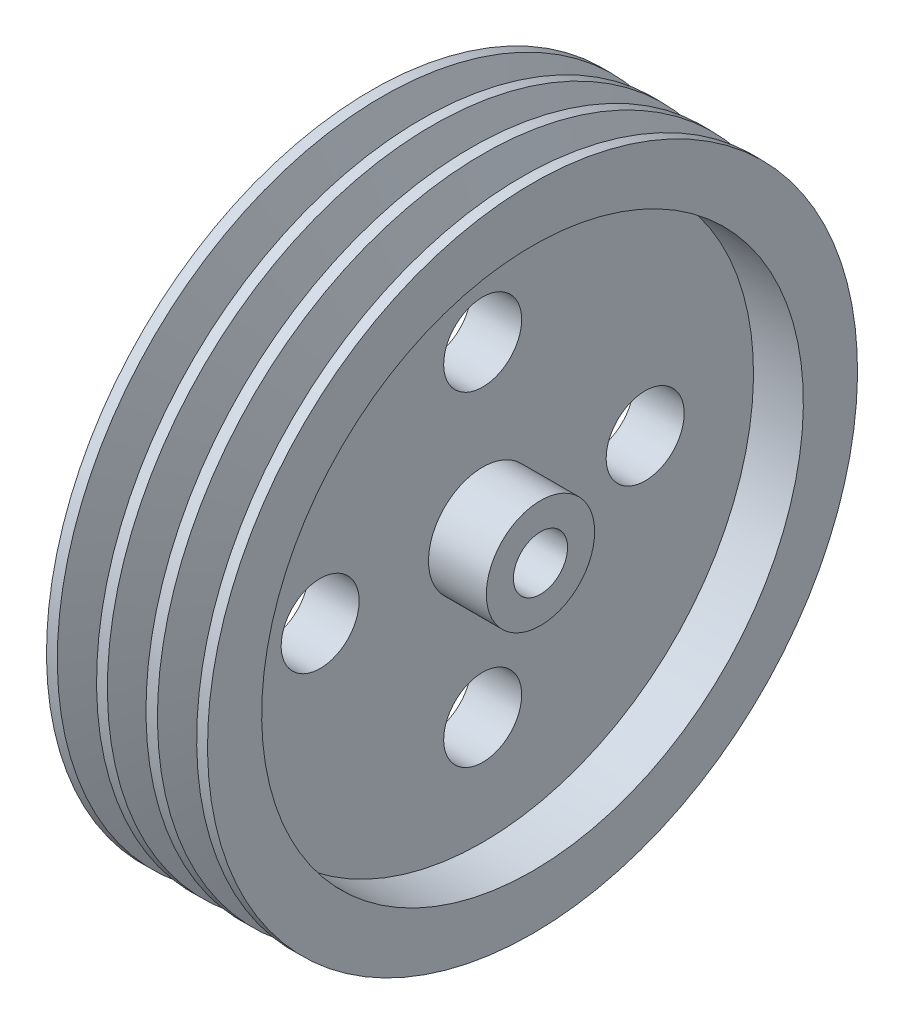
ISO-10303-21;
HEADER;
FILE_DESCRIPTION(('STEP AP214'),'2;1');
FILE_NAME('part.step','',(''),(''),'','','');
FILE_SCHEMA(('AUTOMOTIVE_DESIGN { 1 0 10303 214 1 1 1 1 }'));
ENDSEC;
DATA;
#1=APPLICATION_CONTEXT('core data for automotive mechanical design processes');
#2=APPLICATION_PROTOCOL_DEFINITION('international standard','automotive_design',2000,#1);
#3=PRODUCT_CONTEXT('',#1,'mechanical');
#4=PRODUCT('Part','Part','',(#3));
#5=PRODUCT_RELATED_PRODUCT_CATEGORY('part','',(#4));
#6=PRODUCT_DEFINITION_FORMATION('','',#4);
#7=PRODUCT_DEFINITION_CONTEXT('part definition',#1,'design');
#8=PRODUCT_DEFINITION('design','',#6,#7);
#9=PRODUCT_DEFINITION_SHAPE('','',#8);
#10=(LENGTH_UNIT() NAMED_UNIT(*) SI_UNIT(.MILLI.,.METRE.));
#11=(NAMED_UNIT(*) PLANE_ANGLE_UNIT() SI_UNIT($,.RADIAN.));
#12=(NAMED_UNIT(*) SI_UNIT($,.STERADIAN.) SOLID_ANGLE_UNIT());
#13=UNCERTAINTY_MEASURE_WITH_UNIT(LENGTH_MEASURE(1.E-05),#10,'distance_accuracy_value','');
#14=(GEOMETRIC_REPRESENTATION_CONTEXT(3) GLOBAL_UNCERTAINTY_ASSIGNED_CONTEXT((#13)) GLOBAL_UNIT_ASSIGNED_CONTEXT((#10,
#11,#12)) REPRESENTATION_CONTEXT('',''));
#15=CARTESIAN_POINT('',(0.,0.,0.));
#16=DIRECTION('',(0.,0.,1.));
#17=DIRECTION('',(1.,0.,0.));
#18=AXIS2_PLACEMENT_3D('',#15,#16,#17);
#19=CARTESIAN_POINT('',(0.,0.,0.));
#20=DIRECTION('',(-1.,0.,0.));
#21=DIRECTION('',(0.,-1.,0.));
#22=AXIS2_PLACEMENT_3D('',#19,#20,#21);
#23=CYLINDRICAL_SURFACE('',#22,317.5);
#24=CARTESIAN_POINT('',(1981.2,0.,0.));
#25=DIRECTION('',(-1.,0.,0.));
#26=DIRECTION('',(0.,-1.,0.));
#27=AXIS2_PLACEMENT_3D('',#24,#25,#26);
#28=CIRCLE('',#27,317.5);
#29=CARTESIAN_POINT('',(1981.2,-317.5,0.));
#30=VERTEX_POINT('',#29);
#31=EDGE_CURVE('E139',#30,#30,#28,.T.);
#32=ORIENTED_EDGE('',*,*,#31,.F.);
#33=EDGE_LOOP('',(#32));
#34=FACE_BOUND('',#33,.T.);
#35=CARTESIAN_POINT('',(0.,0.,0.));
#36=DIRECTION('',(-1.,0.,0.));
#37=DIRECTION('',(0.,-1.,0.));
#38=AXIS2_PLACEMENT_3D('',#35,#36,#37);
#39=CIRCLE('',#38,317.5);
#40=CARTESIAN_POINT('',(0.,-317.5,0.));
#41=VERTEX_POINT('',#40);
#42=EDGE_CURVE('E10',#41,#41,#39,.T.);
#43=ORIENTED_EDGE('',*,*,#42,.T.);
#44=EDGE_LOOP('',(#43));
#45=FACE_BOUND('',#44,.T.);
#46=ADVANCED_FACE('F40',(#34,#45),#23,.F.);
#47=CARTESIAN_POINT('',(0.,317.5,0.));
#48=DIRECTION('',(1.,0.,0.));
#49=DIRECTION('',(0.,1.,0.));
#50=AXIS2_PLACEMENT_3D('',#47,#48,#49);
#51=PLANE('',#50);
#52=ORIENTED_EDGE('',*,*,#42,.F.);
#53=EDGE_LOOP('',(#52));
#54=FACE_BOUND('',#53,.T.);
#55=CARTESIAN_POINT('',(0.,0.,0.));
#56=DIRECTION('',(-1.,0.,0.));
#57=DIRECTION('',(0.,-1.,0.));
#58=AXIS2_PLACEMENT_3D('',#55,#56,#57);
#59=CIRCLE('',#58,635.);
#60=CARTESIAN_POINT('',(0.,-635.,0.));
#61=VERTEX_POINT('',#60);
#62=EDGE_CURVE('E47',#61,#61,#59,.T.);
#63=ORIENTED_EDGE('',*,*,#62,.T.);
#64=EDGE_LOOP('',(#63));
#65=FACE_BOUND('',#64,.T.);
#66=ADVANCED_FACE('F208',(#54,#65),#51,.F.);
#67=CARTESIAN_POINT('',(0.,0.,0.));
#68=DIRECTION('',(-1.,0.,0.));
#69=DIRECTION('',(0.,-1.,0.));
#70=AXIS2_PLACEMENT_3D('',#67,#68,#69);
#71=CYLINDRICAL_SURFACE('',#70,635.);
#72=ORIENTED_EDGE('',*,*,#62,.F.);
#73=EDGE_LOOP('',(#72));
#74=FACE_BOUND('',#73,.T.);
#75=CARTESIAN_POINT('',(711.2,0.,0.));
#76=DIRECTION('',(-1.,0.,0.));
#77=DIRECTION('',(0.,-1.,0.));
#78=AXIS2_PLACEMENT_3D('',#75,#76,#77);
#79=CIRCLE('',#78,635.);
#80=CARTESIAN_POINT('',(711.2,-635.,0.));
#81=VERTEX_POINT('',#80);
#82=EDGE_CURVE('E52',#81,#81,#79,.T.);
#83=ORIENTED_EDGE('',*,*,#82,.T.);
#84=EDGE_LOOP('',(#83));
#85=FACE_BOUND('',#84,.T.);
#86=ADVANCED_FACE('F212',(#74,#85),#71,.T.);
#87=CARTESIAN_POINT('',(711.2,635.,0.));
#88=DIRECTION('',(1.,0.,0.));
#89=DIRECTION('',(0.,1.,0.));
#90=AXIS2_PLACEMENT_3D('',#87,#88,#89);
#91=PLANE('',#90);
#92=CARTESIAN_POINT('',(711.2,1905.,0.));
#93=DIRECTION('',(1.,0.,0.));
#94=DIRECTION('',(0.,1.,0.));
#95=AXIS2_PLACEMENT_3D('',#92,#93,#94);
#96=CIRCLE('',#95,457.2);
#97=CARTESIAN_POINT('',(711.2,2362.2,0.));
#98=VERTEX_POINT('',#97);
#99=EDGE_CURVE('E143',#98,#98,#96,.F.);
#100=ORIENTED_EDGE('',*,*,#99,.F.);
#101=EDGE_LOOP('',(#100));
#102=FACE_BOUND('',#101,.T.);
#103=CARTESIAN_POINT('',(711.2,-1905.,0.));
#104=DIRECTION('',(1.,0.,0.));
#105=DIRECTION('',(0.,1.,0.));
#106=AXIS2_PLACEMENT_3D('',#103,#104,#105);
#107=CIRCLE('',#106,457.2);
#108=CARTESIAN_POINT('',(711.2,-1447.8,0.));
#109=VERTEX_POINT('',#108);
#110=EDGE_CURVE('E157',#109,#109,#107,.F.);
#111=ORIENTED_EDGE('',*,*,#110,.F.);
#112=EDGE_LOOP('',(#111));
#113=FACE_BOUND('',#112,.T.);
#114=CARTESIAN_POINT('',(711.2,0.,-1905.));
#115=DIRECTION('',(1.,0.,0.));
#116=DIRECTION('',(0.,1.,0.));
#117=AXIS2_PLACEMENT_3D('',#114,#115,#116);
#118=CIRCLE('',#117,457.2);
#119=CARTESIAN_POINT('',(711.2,457.2,-1905.));
#120=VERTEX_POINT('',#119);
#121=EDGE_CURVE('E148',#120,#120,#118,.F.);
#122=ORIENTED_EDGE('',*,*,#121,.F.);
#123=EDGE_LOOP('',(#122));
#124=FACE_BOUND('',#123,.T.);
#125=CARTESIAN_POINT('',(711.2,0.,1905.));
#126=DIRECTION('',(1.,0.,0.));
#127=DIRECTION('',(0.,1.,0.));
#128=AXIS2_PLACEMENT_3D('',#125,#126,#127);
#129=CIRCLE('',#128,457.2);
#130=CARTESIAN_POINT('',(711.2,457.2,1905.));
#131=VERTEX_POINT('',#130);
#132=EDGE_CURVE('E149',#131,#131,#129,.F.);
#133=ORIENTED_EDGE('',*,*,#132,.F.);
#134=EDGE_LOOP('',(#133));
#135=FACE_BOUND('',#134,.T.);
#136=ORIENTED_EDGE('',*,*,#82,.F.);
#137=EDGE_LOOP('',(#136));
#138=FACE_BOUND('',#137,.T.);
#139=CARTESIAN_POINT('',(711.2,0.,0.));
#140=DIRECTION('',(-1.,0.,0.));
#141=DIRECTION('',(0.,-1.,0.));
#142=AXIS2_PLACEMENT_3D('',#139,#140,#141);
#143=CIRCLE('',#142,3175.);
#144=CARTESIAN_POINT('',(711.2,-3175.,0.));
#145=VERTEX_POINT('',#144);
#146=EDGE_CURVE('E57',#145,#145,#143,.T.);
#147=ORIENTED_EDGE('',*,*,#146,.T.);
#148=EDGE_LOOP('',(#147));
#149=FACE_BOUND('',#148,.T.);
#150=ADVANCED_FACE('F217',(#102,#113,#124,#135,#138,#149),#91,.F.);
#151=CARTESIAN_POINT('',(0.,0.,0.));
#152=DIRECTION('',(-1.,0.,0.));
#153=DIRECTION('',(0.,-1.,0.));
#154=AXIS2_PLACEMENT_3D('',#151,#152,#153);
#155=CYLINDRICAL_SURFACE('',#154,3175.);
#156=ORIENTED_EDGE('',*,*,#146,.F.);
#157=EDGE_LOOP('',(#156));
#158=FACE_BOUND('',#157,.T.);
#159=CARTESIAN_POINT('',(0.,0.,0.));
#160=DIRECTION('',(-1.,0.,0.));
#161=DIRECTION('',(0.,-1.,0.));
#162=AXIS2_PLACEMENT_3D('',#159,#160,#161);
#163=CIRCLE('',#162,3175.);
#164=CARTESIAN_POINT('',(1.77920356510442E-13,-3175.,0.));
#165=VERTEX_POINT('',#164);
#166=EDGE_CURVE('E63',#165,#165,#163,.T.);
#167=ORIENTED_EDGE('',*,*,#166,.T.);
#168=EDGE_LOOP('',(#167));
#169=FACE_BOUND('',#168,.T.);
#170=ADVANCED_FACE('F223',(#158,#169),#155,.F.);
#171=CARTESIAN_POINT('',(0.,3810.,0.));
#172=DIRECTION('',(1.,0.,0.));
#173=DIRECTION('',(0.,1.,0.));
#174=AXIS2_PLACEMENT_3D('',#171,#172,#173);
#175=PLANE('',#174);
#176=ORIENTED_EDGE('',*,*,#166,.F.);
#177=EDGE_LOOP('',(#176));
#178=FACE_BOUND('',#177,.T.);
#179=CARTESIAN_POINT('',(1.06752213906265E-13,0.,0.));
#180=DIRECTION('',(-1.,0.,0.));
#181=DIRECTION('',(0.,-1.,0.));
#182=AXIS2_PLACEMENT_3D('',#179,#180,#181);
#183=CIRCLE('',#182,3810.);
#184=CARTESIAN_POINT('',(2.1350442781253E-13,-3810.,0.));
#185=VERTEX_POINT('',#184);
#186=EDGE_CURVE('E67',#185,#185,#183,.T.);
#187=ORIENTED_EDGE('',*,*,#186,.T.);
#188=EDGE_LOOP('',(#187));
#189=FACE_BOUND('',#188,.T.);
#190=ADVANCED_FACE('F227',(#178,#189),#175,.F.);
#191=CARTESIAN_POINT('',(0.,0.,0.));
#192=DIRECTION('',(-1.,0.,0.));
#193=DIRECTION('',(0.,-1.,0.));
#194=AXIS2_PLACEMENT_3D('',#191,#192,#193);
#195=CYLINDRICAL_SURFACE('',#194,3810.);
#196=ORIENTED_EDGE('',*,*,#186,.F.);
#197=EDGE_LOOP('',(#196));
#198=FACE_BOUND('',#197,.T.);
#199=CARTESIAN_POINT('',(127.,0.,0.));
#200=DIRECTION('',(-1.,0.,0.));
#201=DIRECTION('',(0.,-1.,0.));
#202=AXIS2_PLACEMENT_3D('',#199,#200,#201);
#203=CIRCLE('',#202,3810.);
#204=CARTESIAN_POINT('',(127.,-3810.,0.));
#205=VERTEX_POINT('',#204);
#206=EDGE_CURVE('E71',#205,#205,#203,.T.);
#207=ORIENTED_EDGE('',*,*,#206,.T.);
#208=EDGE_LOOP('',(#207));
#209=FACE_BOUND('',#208,.T.);
#210=ADVANCED_FACE('F231',(#198,#209),#195,.T.);
#211=CARTESIAN_POINT('',(293.407191106508,0.,0.));
#212=DIRECTION('',(-1.,0.,0.));
#213=DIRECTION('',(0.,-1.,0.));
#214=AXIS2_PLACEMENT_3D('',#211,#212,#213);
#215=CONICAL_SURFACE('',#214,3352.8,1.22173047639603);
#216=ORIENTED_EDGE('',*,*,#206,.F.);
#217=EDGE_LOOP('',(#216));
#218=FACE_BOUND('',#217,.T.);
#219=CARTESIAN_POINT('',(293.407191106508,0.,0.));
#220=DIRECTION('',(-1.,0.,0.));
#221=DIRECTION('',(0.,-1.,0.));
#222=AXIS2_PLACEMENT_3D('',#219,#220,#221);
#223=CIRCLE('',#222,3352.8);
#224=CARTESIAN_POINT('',(293.407191106508,-3352.8,0.));
#225=VERTEX_POINT('',#224);
#226=EDGE_CURVE('E75',#225,#225,#223,.T.);
#227=ORIENTED_EDGE('',*,*,#226,.T.);
#228=EDGE_LOOP('',(#227));
#229=FACE_BOUND('',#228,.T.);
#230=ADVANCED_FACE('F235',(#218,#229),#215,.T.);
#231=CARTESIAN_POINT('',(0.,0.,0.));
#232=DIRECTION('',(-1.,0.,0.));
#233=DIRECTION('',(0.,-1.,0.));
#234=AXIS2_PLACEMENT_3D('',#231,#232,#233);
#235=CYLINDRICAL_SURFACE('',#234,3352.8);
#236=ORIENTED_EDGE('',*,*,#226,.F.);
#237=EDGE_LOOP('',(#236));
#238=FACE_BOUND('',#237,.T.);
#239=CARTESIAN_POINT('',(420.407191106508,0.,0.));
#240=DIRECTION('',(-1.,0.,0.));
#241=DIRECTION('',(0.,-1.,0.));
#242=AXIS2_PLACEMENT_3D('',#239,#240,#241);
#243=CIRCLE('',#242,3352.8);
#244=CARTESIAN_POINT('',(420.407191106508,-3352.8,0.));
#245=VERTEX_POINT('',#244);
#246=EDGE_CURVE('E79',#245,#245,#243,.T.);
#247=ORIENTED_EDGE('',*,*,#246,.T.);
#248=EDGE_LOOP('',(#247));
#249=FACE_BOUND('',#248,.T.);
#250=ADVANCED_FACE('F239',(#238,#249),#235,.T.);
#251=CARTESIAN_POINT('',(586.814382213012,0.,0.));
#252=DIRECTION('',(1.,0.,0.));
#253=DIRECTION('',(0.,1.,0.));
#254=AXIS2_PLACEMENT_3D('',#251,#252,#253);
#255=CONICAL_SURFACE('',#254,3810.,1.22173047639604);
#256=ORIENTED_EDGE('',*,*,#246,.F.);
#257=EDGE_LOOP('',(#256));
#258=FACE_BOUND('',#257,.T.);
#259=CARTESIAN_POINT('',(586.814382213012,0.,0.));
#260=DIRECTION('',(-1.,0.,0.));
#261=DIRECTION('',(0.,-1.,0.));
#262=AXIS2_PLACEMENT_3D('',#259,#260,#261);
#263=CIRCLE('',#262,3810.);
#264=CARTESIAN_POINT('',(586.814382213012,-3810.,0.));
#265=VERTEX_POINT('',#264);
#266=EDGE_CURVE('E83',#265,#265,#263,.T.);
#267=ORIENTED_EDGE('',*,*,#266,.T.);
#268=EDGE_LOOP('',(#267));
#269=FACE_BOUND('',#268,.T.);
#270=ADVANCED_FACE('F243',(#258,#269),#255,.T.);
#271=CARTESIAN_POINT('',(0.,0.,0.));
#272=DIRECTION('',(-1.,0.,0.));
#273=DIRECTION('',(0.,-1.,0.));
#274=AXIS2_PLACEMENT_3D('',#271,#272,#273);
#275=CYLINDRICAL_SURFACE('',#274,3810.);
#276=ORIENTED_EDGE('',*,*,#266,.F.);
#277=EDGE_LOOP('',(#276));
#278=FACE_BOUND('',#277,.T.);
#279=CARTESIAN_POINT('',(713.814382213012,0.,0.));
#280=DIRECTION('',(-1.,0.,0.));
#281=DIRECTION('',(0.,-1.,0.));
#282=AXIS2_PLACEMENT_3D('',#279,#280,#281);
#283=CIRCLE('',#282,3810.);
#284=CARTESIAN_POINT('',(713.814382213012,-3810.,0.));
#285=VERTEX_POINT('',#284);
#286=EDGE_CURVE('E87',#285,#285,#283,.T.);
#287=ORIENTED_EDGE('',*,*,#286,.T.);
#288=EDGE_LOOP('',(#287));
#289=FACE_BOUND('',#288,.T.);
#290=ADVANCED_FACE('F247',(#278,#289),#275,.T.);
#291=CARTESIAN_POINT('',(876.488852113167,0.,0.));
#292=DIRECTION('',(-1.,0.,0.));
#293=DIRECTION('',(0.,-1.,0.));
#294=AXIS2_PLACEMENT_3D('',#291,#292,#293);
#295=CONICAL_SURFACE('',#294,3363.05556722758,1.22173047639603);
#296=ORIENTED_EDGE('',*,*,#286,.F.);
#297=EDGE_LOOP('',(#296));
#298=FACE_BOUND('',#297,.T.);
#299=CARTESIAN_POINT('',(876.488852113167,0.,0.));
#300=DIRECTION('',(-1.,0.,0.));
#301=DIRECTION('',(0.,-1.,0.));
#302=AXIS2_PLACEMENT_3D('',#299,#300,#301);
#303=CIRCLE('',#302,3363.05556722758);
#304=CARTESIAN_POINT('',(876.488852113167,-3363.05556722758,0.));
#305=VERTEX_POINT('',#304);
#306=EDGE_CURVE('E91',#305,#305,#303,.T.);
#307=ORIENTED_EDGE('',*,*,#306,.T.);
#308=EDGE_LOOP('',(#307));
#309=FACE_BOUND('',#308,.T.);
#310=ADVANCED_FACE('F251',(#298,#309),#295,.T.);
#311=CARTESIAN_POINT('',(0.,0.,0.));
#312=DIRECTION('',(-1.,0.,0.));
#313=DIRECTION('',(0.,-1.,0.));
#314=AXIS2_PLACEMENT_3D('',#311,#312,#313);
#315=CYLINDRICAL_SURFACE('',#314,3363.05556722758);
#316=ORIENTED_EDGE('',*,*,#306,.F.);
#317=EDGE_LOOP('',(#316));
#318=FACE_BOUND('',#317,.T.);
#319=CARTESIAN_POINT('',(1003.48885211317,0.,0.));
#320=DIRECTION('',(-1.,0.,0.));
#321=DIRECTION('',(0.,-1.,0.));
#322=AXIS2_PLACEMENT_3D('',#319,#320,#321);
#323=CIRCLE('',#322,3363.05556722758);
#324=CARTESIAN_POINT('',(1003.48885211317,-3363.05556722758,0.));
#325=VERTEX_POINT('',#324);
#326=EDGE_CURVE('E95',#325,#325,#323,.T.);
#327=ORIENTED_EDGE('',*,*,#326,.T.);
#328=EDGE_LOOP('',(#327));
#329=FACE_BOUND('',#328,.T.);
#330=ADVANCED_FACE('F255',(#318,#329),#315,.T.);
#331=CARTESIAN_POINT('',(1166.16332201332,0.,0.));
#332=DIRECTION('',(1.,0.,0.));
#333=DIRECTION('',(0.,1.,0.));
#334=AXIS2_PLACEMENT_3D('',#331,#332,#333);
#335=CONICAL_SURFACE('',#334,3810.,1.22173047639603);
#336=ORIENTED_EDGE('',*,*,#326,.F.);
#337=EDGE_LOOP('',(#336));
#338=FACE_BOUND('',#337,.T.);
#339=CARTESIAN_POINT('',(1166.16332201332,0.,0.));
#340=DIRECTION('',(-1.,0.,0.));
#341=DIRECTION('',(0.,-1.,0.));
#342=AXIS2_PLACEMENT_3D('',#339,#340,#341);
#343=CIRCLE('',#342,3810.);
#344=CARTESIAN_POINT('',(1166.16332201332,-3810.,0.));
#345=VERTEX_POINT('',#344);
#346=EDGE_CURVE('E99',#345,#345,#343,.T.);
#347=ORIENTED_EDGE('',*,*,#346,.T.);
#348=EDGE_LOOP('',(#347));
#349=FACE_BOUND('',#348,.T.);
#350=ADVANCED_FACE('F259',(#338,#349),#335,.T.);
#351=CARTESIAN_POINT('',(0.,0.,0.));
#352=DIRECTION('',(-1.,0.,0.));
#353=DIRECTION('',(0.,-1.,0.));
#354=AXIS2_PLACEMENT_3D('',#351,#352,#353);
#355=CYLINDRICAL_SURFACE('',#354,3810.);
#356=ORIENTED_EDGE('',*,*,#346,.F.);
#357=EDGE_LOOP('',(#356));
#358=FACE_BOUND('',#357,.T.);
#359=CARTESIAN_POINT('',(1300.62876442603,0.,0.));
#360=DIRECTION('',(-1.,0.,0.));
#361=DIRECTION('',(0.,-1.,0.));
#362=AXIS2_PLACEMENT_3D('',#359,#360,#361);
#363=CIRCLE('',#362,3810.);
#364=CARTESIAN_POINT('',(1300.62876442603,-3810.,0.));
#365=VERTEX_POINT('',#364);
#366=EDGE_CURVE('E103',#365,#365,#363,.T.);
#367=ORIENTED_EDGE('',*,*,#366,.T.);
#368=EDGE_LOOP('',(#367));
#369=FACE_BOUND('',#368,.T.);
#370=ADVANCED_FACE('F263',(#358,#369),#355,.T.);
#371=CARTESIAN_POINT('',(1456.16762086611,0.,0.));
#372=DIRECTION('',(-1.,0.,0.));
#373=DIRECTION('',(0.,-1.,0.));
#374=AXIS2_PLACEMENT_3D('',#371,#372,#373);
#375=CONICAL_SURFACE('',#374,3352.8,1.24287969919576);
#376=ORIENTED_EDGE('',*,*,#366,.F.);
#377=EDGE_LOOP('',(#376));
#378=FACE_BOUND('',#377,.T.);
#379=CARTESIAN_POINT('',(1456.16762086611,0.,0.));
#380=DIRECTION('',(-1.,0.,0.));
#381=DIRECTION('',(0.,-1.,0.));
#382=AXIS2_PLACEMENT_3D('',#379,#380,#381);
#383=CIRCLE('',#382,3352.8);
#384=CARTESIAN_POINT('',(1456.16762086611,-3352.8,0.));
#385=VERTEX_POINT('',#384);
#386=EDGE_CURVE('E107',#385,#385,#383,.T.);
#387=ORIENTED_EDGE('',*,*,#386,.T.);
#388=EDGE_LOOP('',(#387));
#389=FACE_BOUND('',#388,.T.);
#390=ADVANCED_FACE('F267',(#378,#389),#375,.T.);
#391=CARTESIAN_POINT('',(0.,0.,0.));
#392=DIRECTION('',(-1.,0.,0.));
#393=DIRECTION('',(0.,-1.,0.));
#394=AXIS2_PLACEMENT_3D('',#391,#392,#393);
#395=CYLINDRICAL_SURFACE('',#394,3352.8);
#396=ORIENTED_EDGE('',*,*,#386,.F.);
#397=EDGE_LOOP('',(#396));
#398=FACE_BOUND('',#397,.T.);
#399=CARTESIAN_POINT('',(1583.16762086611,0.,0.));
#400=DIRECTION('',(-1.,0.,0.));
#401=DIRECTION('',(0.,-1.,0.));
#402=AXIS2_PLACEMENT_3D('',#399,#400,#401);
#403=CIRCLE('',#402,3352.8);
#404=CARTESIAN_POINT('',(1583.16762086611,-3352.8,0.));
#405=VERTEX_POINT('',#404);
#406=EDGE_CURVE('E111',#405,#405,#403,.T.);
#407=ORIENTED_EDGE('',*,*,#406,.T.);
#408=EDGE_LOOP('',(#407));
#409=FACE_BOUND('',#408,.T.);
#410=ADVANCED_FACE('F271',(#398,#409),#395,.T.);
#411=CARTESIAN_POINT('',(1760.61179205344,0.,0.));
#412=DIRECTION('',(1.,0.,0.));
#413=DIRECTION('',(0.,1.,0.));
#414=AXIS2_PLACEMENT_3D('',#411,#412,#413);
#415=CONICAL_SURFACE('',#414,3810.,1.2005812535963);
#416=ORIENTED_EDGE('',*,*,#406,.F.);
#417=EDGE_LOOP('',(#416));
#418=FACE_BOUND('',#417,.T.);
#419=CARTESIAN_POINT('',(1760.61179205344,0.,0.));
#420=DIRECTION('',(-1.,0.,0.));
#421=DIRECTION('',(0.,-1.,0.));
#422=AXIS2_PLACEMENT_3D('',#419,#420,#421);
#423=CIRCLE('',#422,3810.);
#424=CARTESIAN_POINT('',(1760.61179205344,-3810.,0.));
#425=VERTEX_POINT('',#424);
#426=EDGE_CURVE('E115',#425,#425,#423,.T.);
#427=ORIENTED_EDGE('',*,*,#426,.T.);
#428=EDGE_LOOP('',(#427));
#429=FACE_BOUND('',#428,.T.);
#430=ADVANCED_FACE('F275',(#418,#429),#415,.T.);
#431=CARTESIAN_POINT('',(0.,0.,0.));
#432=DIRECTION('',(-1.,0.,0.));
#433=DIRECTION('',(0.,-1.,0.));
#434=AXIS2_PLACEMENT_3D('',#431,#432,#433);
#435=CYLINDRICAL_SURFACE('',#434,3810.);
#436=ORIENTED_EDGE('',*,*,#426,.F.);
#437=EDGE_LOOP('',(#436));
#438=FACE_BOUND('',#437,.T.);
#439=CARTESIAN_POINT('',(1887.61179205344,0.,0.));
#440=DIRECTION('',(-1.,0.,0.));
#441=DIRECTION('',(0.,-1.,0.));
#442=AXIS2_PLACEMENT_3D('',#439,#440,#441);
#443=CIRCLE('',#442,3810.);
#444=CARTESIAN_POINT('',(1887.61179205344,-3810.,0.));
#445=VERTEX_POINT('',#444);
#446=EDGE_CURVE('E119',#445,#445,#443,.T.);
#447=ORIENTED_EDGE('',*,*,#446,.T.);
#448=EDGE_LOOP('',(#447));
#449=FACE_BOUND('',#448,.T.);
#450=ADVANCED_FACE('F279',(#438,#449),#435,.T.);
#451=CARTESIAN_POINT('',(1887.61179205344,3810.,0.));
#452=DIRECTION('',(-1.,0.,0.));
#453=DIRECTION('',(0.,-1.,0.));
#454=AXIS2_PLACEMENT_3D('',#451,#452,#453);
#455=PLANE('',#454);
#456=ORIENTED_EDGE('',*,*,#446,.F.);
#457=EDGE_LOOP('',(#456));
#458=FACE_BOUND('',#457,.T.);
#459=CARTESIAN_POINT('',(1887.61179205344,0.,0.));
#460=DIRECTION('',(-1.,0.,0.));
#461=DIRECTION('',(0.,-1.,0.));
#462=AXIS2_PLACEMENT_3D('',#459,#460,#461);
#463=CIRCLE('',#462,3175.);
#464=CARTESIAN_POINT('',(1887.61179205344,-3175.,0.));
#465=VERTEX_POINT('',#464);
#466=EDGE_CURVE('E123',#465,#465,#463,.T.);
#467=ORIENTED_EDGE('',*,*,#466,.T.);
#468=EDGE_LOOP('',(#467));
#469=FACE_BOUND('',#468,.T.);
#470=ADVANCED_FACE('F283',(#458,#469),#455,.F.);
#471=CARTESIAN_POINT('',(0.,0.,0.));
#472=DIRECTION('',(-1.,0.,0.));
#473=DIRECTION('',(0.,-1.,0.));
#474=AXIS2_PLACEMENT_3D('',#471,#472,#473);
#475=CYLINDRICAL_SURFACE('',#474,3175.);
#476=ORIENTED_EDGE('',*,*,#466,.F.);
#477=EDGE_LOOP('',(#476));
#478=FACE_BOUND('',#477,.T.);
#479=CARTESIAN_POINT('',(1303.24314663904,0.,0.));
#480=DIRECTION('',(-1.,0.,0.));
#481=DIRECTION('',(0.,-1.,0.));
#482=AXIS2_PLACEMENT_3D('',#479,#480,#481);
#483=CIRCLE('',#482,3175.);
#484=CARTESIAN_POINT('',(1303.24314663904,-3175.,0.));
#485=VERTEX_POINT('',#484);
#486=EDGE_CURVE('E127',#485,#485,#483,.T.);
#487=ORIENTED_EDGE('',*,*,#486,.T.);
#488=EDGE_LOOP('',(#487));
#489=FACE_BOUND('',#488,.T.);
#490=ADVANCED_FACE('F183',(#478,#489),#475,.F.);
#491=CARTESIAN_POINT('',(1303.24314663904,635.,0.));
#492=DIRECTION('',(-1.,0.,0.));
#493=DIRECTION('',(0.,-1.,0.));
#494=AXIS2_PLACEMENT_3D('',#491,#492,#493);
#495=PLANE('',#494);
#496=CARTESIAN_POINT('',(1303.24314663904,1905.,0.));
#497=DIRECTION('',(1.,0.,0.));
#498=DIRECTION('',(0.,1.,0.));
#499=AXIS2_PLACEMENT_3D('',#496,#497,#498);
#500=CIRCLE('',#499,457.2);
#501=CARTESIAN_POINT('',(1303.24314663904,2362.2,0.));
#502=VERTEX_POINT('',#501);
#503=EDGE_CURVE('E165',#502,#502,#500,.T.);
#504=ORIENTED_EDGE('',*,*,#503,.F.);
#505=EDGE_LOOP('',(#504));
#506=FACE_BOUND('',#505,.T.);
#507=CARTESIAN_POINT('',(1303.24314663904,-1905.,0.));
#508=DIRECTION('',(1.,0.,0.));
#509=DIRECTION('',(0.,1.,0.));
#510=AXIS2_PLACEMENT_3D('',#507,#508,#509);
#511=CIRCLE('',#510,457.2);
#512=CARTESIAN_POINT('',(1303.24314663904,-1447.8,0.));
#513=VERTEX_POINT('',#512);
#514=EDGE_CURVE('E161',#513,#513,#511,.T.);
#515=ORIENTED_EDGE('',*,*,#514,.F.);
#516=EDGE_LOOP('',(#515));
#517=FACE_BOUND('',#516,.T.);
#518=CARTESIAN_POINT('',(1303.24314663904,0.,-1905.));
#519=DIRECTION('',(1.,0.,0.));
#520=DIRECTION('',(0.,1.,0.));
#521=AXIS2_PLACEMENT_3D('',#518,#519,#520);
#522=CIRCLE('',#521,457.2);
#523=CARTESIAN_POINT('',(1303.24314663904,457.2,-1905.));
#524=VERTEX_POINT('',#523);
#525=EDGE_CURVE('E153',#524,#524,#522,.T.);
#526=ORIENTED_EDGE('',*,*,#525,.F.);
#527=EDGE_LOOP('',(#526));
#528=FACE_BOUND('',#527,.T.);
#529=CARTESIAN_POINT('',(1303.24314663904,0.,1905.));
#530=DIRECTION('',(1.,0.,0.));
#531=DIRECTION('',(0.,1.,0.));
#532=AXIS2_PLACEMENT_3D('',#529,#530,#531);
#533=CIRCLE('',#532,457.2);
#534=CARTESIAN_POINT('',(1303.24314663904,457.2,1905.));
#535=VERTEX_POINT('',#534);
#536=EDGE_CURVE('E144',#535,#535,#533,.T.);
#537=ORIENTED_EDGE('',*,*,#536,.F.);
#538=EDGE_LOOP('',(#537));
#539=FACE_BOUND('',#538,.T.);
#540=ORIENTED_EDGE('',*,*,#486,.F.);
#541=EDGE_LOOP('',(#540));
#542=FACE_BOUND('',#541,.T.);
#543=CARTESIAN_POINT('',(1303.24314663904,0.,0.));
#544=DIRECTION('',(-1.,0.,0.));
#545=DIRECTION('',(0.,-1.,0.));
#546=AXIS2_PLACEMENT_3D('',#543,#544,#545);
#547=CIRCLE('',#546,635.);
#548=CARTESIAN_POINT('',(1303.24314663904,-635.,0.));
#549=VERTEX_POINT('',#548);
#550=EDGE_CURVE('E131',#549,#549,#547,.T.);
#551=ORIENTED_EDGE('',*,*,#550,.T.);
#552=EDGE_LOOP('',(#551));
#553=FACE_BOUND('',#552,.T.);
#554=ADVANCED_FACE('F179',(#506,#517,#528,#539,#542,#553),#495,.F.);
#555=CARTESIAN_POINT('',(0.,0.,0.));
#556=DIRECTION('',(-1.,0.,0.));
#557=DIRECTION('',(0.,-1.,0.));
#558=AXIS2_PLACEMENT_3D('',#555,#556,#557);
#559=CYLINDRICAL_SURFACE('',#558,635.);
#560=ORIENTED_EDGE('',*,*,#550,.F.);
#561=EDGE_LOOP('',(#560));
#562=FACE_BOUND('',#561,.T.);
#563=CARTESIAN_POINT('',(1981.2,0.,0.));
#564=DIRECTION('',(-1.,0.,0.));
#565=DIRECTION('',(0.,-1.,0.));
#566=AXIS2_PLACEMENT_3D('',#563,#564,#565);
#567=CIRCLE('',#566,635.);
#568=CARTESIAN_POINT('',(1981.2,-635.,0.));
#569=VERTEX_POINT('',#568);
#570=EDGE_CURVE('E135',#569,#569,#567,.T.);
#571=ORIENTED_EDGE('',*,*,#570,.T.);
#572=EDGE_LOOP('',(#571));
#573=FACE_BOUND('',#572,.T.);
#574=ADVANCED_FACE('F182',(#562,#573),#559,.T.);
#575=CARTESIAN_POINT('',(1981.2,635.,0.));
#576=DIRECTION('',(-1.,0.,0.));
#577=DIRECTION('',(0.,-1.,0.));
#578=AXIS2_PLACEMENT_3D('',#575,#576,#577);
#579=PLANE('',#578);
#580=ORIENTED_EDGE('',*,*,#570,.F.);
#581=EDGE_LOOP('',(#580));
#582=FACE_BOUND('',#581,.T.);
#583=ORIENTED_EDGE('',*,*,#31,.T.);
#584=EDGE_LOOP('',(#583));
#585=FACE_BOUND('',#584,.T.);
#586=ADVANCED_FACE('F197',(#582,#585),#579,.F.);
#587=CARTESIAN_POINT('',(-0.00100000000013978,0.,1905.));
#588=DIRECTION('',(1.,0.,0.));
#589=DIRECTION('',(0.,1.,0.));
#590=AXIS2_PLACEMENT_3D('',#587,#588,#589);
#591=CYLINDRICAL_SURFACE('',#590,457.2);
#592=ORIENTED_EDGE('',*,*,#536,.T.);
#593=EDGE_LOOP('',(#592));
#594=FACE_BOUND('',#593,.T.);
#595=ORIENTED_EDGE('',*,*,#132,.T.);
#596=EDGE_LOOP('',(#595));
#597=FACE_BOUND('',#596,.T.);
#598=ADVANCED_FACE('F203',(#594,#597),#591,.F.);
#599=CARTESIAN_POINT('',(-0.00100000000013978,0.,-1905.));
#600=DIRECTION('',(1.,0.,0.));
#601=DIRECTION('',(0.,1.,0.));
#602=AXIS2_PLACEMENT_3D('',#599,#600,#601);
#603=CYLINDRICAL_SURFACE('',#602,457.2);
#604=ORIENTED_EDGE('',*,*,#525,.T.);
#605=EDGE_LOOP('',(#604));
#606=FACE_BOUND('',#605,.T.);
#607=ORIENTED_EDGE('',*,*,#121,.T.);
#608=EDGE_LOOP('',(#607));
#609=FACE_BOUND('',#608,.T.);
#610=ADVANCED_FACE('F293',(#606,#609),#603,.F.);
#611=CARTESIAN_POINT('',(-0.00100000000013978,-1905.,0.));
#612=DIRECTION('',(1.,0.,0.));
#613=DIRECTION('',(0.,1.,0.));
#614=AXIS2_PLACEMENT_3D('',#611,#612,#613);
#615=CYLINDRICAL_SURFACE('',#614,457.2);
#616=ORIENTED_EDGE('',*,*,#514,.T.);
#617=EDGE_LOOP('',(#616));
#618=FACE_BOUND('',#617,.T.);
#619=ORIENTED_EDGE('',*,*,#110,.T.);
#620=EDGE_LOOP('',(#619));
#621=FACE_BOUND('',#620,.T.);
#622=ADVANCED_FACE('F297',(#618,#621),#615,.F.);
#623=CARTESIAN_POINT('',(-0.00100000000013978,1905.,0.));
#624=DIRECTION('',(1.,0.,0.));
#625=DIRECTION('',(0.,1.,0.));
#626=AXIS2_PLACEMENT_3D('',#623,#624,#625);
#627=CYLINDRICAL_SURFACE('',#626,457.2);
#628=ORIENTED_EDGE('',*,*,#503,.T.);
#629=EDGE_LOOP('',(#628));
#630=FACE_BOUND('',#629,.T.);
#631=ORIENTED_EDGE('',*,*,#99,.T.);
#632=EDGE_LOOP('',(#631));
#633=FACE_BOUND('',#632,.T.);
#634=ADVANCED_FACE('F176',(#630,#633),#627,.F.);
#635=CLOSED_SHELL('',(#46,#66,#86,#150,#170,#190,#210,#230,#250,#270,#290,#310,#330,#350,#370,
#390,#410,#430,#450,#470,#490,#554,#574,#586,#598,#610,#622,#634));
#636=MANIFOLD_SOLID_BREP('B2',#635);
#637=ADVANCED_BREP_SHAPE_REPRESENTATION('',(#18,#636),#14);
#638=SHAPE_DEFINITION_REPRESENTATION(#9,#637);
ENDSEC;
END-ISO-10303-21;
